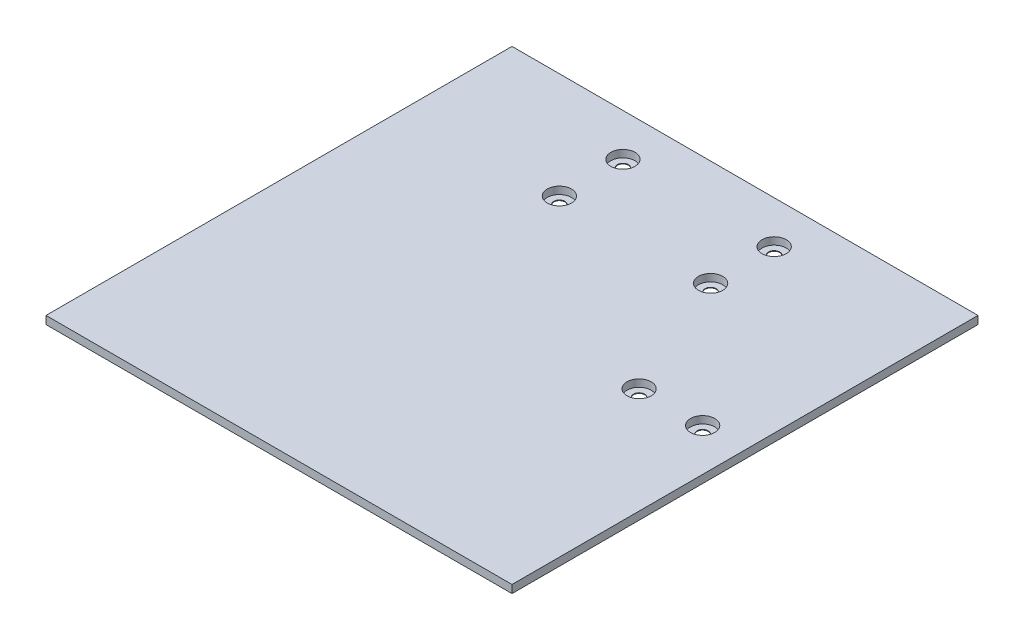
ISO-10303-21;
HEADER;
FILE_DESCRIPTION(('STEP AP214'),'2;1');
FILE_NAME('part.step','',(''),(''),'','','');
FILE_SCHEMA(('AUTOMOTIVE_DESIGN { 1 0 10303 214 1 1 1 1 }'));
ENDSEC;
DATA;
#1=APPLICATION_CONTEXT('core data for automotive mechanical design processes');
#2=APPLICATION_PROTOCOL_DEFINITION('international standard','automotive_design',2000,#1);
#3=PRODUCT_CONTEXT('',#1,'mechanical');
#4=PRODUCT('Part','Part','',(#3));
#5=PRODUCT_RELATED_PRODUCT_CATEGORY('part','',(#4));
#6=PRODUCT_DEFINITION_FORMATION('','',#4);
#7=PRODUCT_DEFINITION_CONTEXT('part definition',#1,'design');
#8=PRODUCT_DEFINITION('design','',#6,#7);
#9=PRODUCT_DEFINITION_SHAPE('','',#8);
#10=(LENGTH_UNIT() NAMED_UNIT(*) SI_UNIT(.MILLI.,.METRE.));
#11=(NAMED_UNIT(*) PLANE_ANGLE_UNIT() SI_UNIT($,.RADIAN.));
#12=(NAMED_UNIT(*) SI_UNIT($,.STERADIAN.) SOLID_ANGLE_UNIT());
#13=UNCERTAINTY_MEASURE_WITH_UNIT(LENGTH_MEASURE(1.E-05),#10,'distance_accuracy_value','');
#14=(GEOMETRIC_REPRESENTATION_CONTEXT(3) GLOBAL_UNCERTAINTY_ASSIGNED_CONTEXT((#13)) GLOBAL_UNIT_ASSIGNED_CONTEXT((#10,
#11,#12)) REPRESENTATION_CONTEXT('',''));
#15=CARTESIAN_POINT('',(0.,0.,0.));
#16=DIRECTION('',(0.,0.,1.));
#17=DIRECTION('',(1.,0.,0.));
#18=AXIS2_PLACEMENT_3D('',#15,#16,#17);
#19=CARTESIAN_POINT('',(-139.7,4.7625,139.7));
#20=DIRECTION('',(-1.,0.,0.));
#21=DIRECTION('',(0.,0.,1.));
#22=AXIS2_PLACEMENT_3D('',#19,#20,#21);
#23=PLANE('',#22);
#24=DIRECTION('',(0.,0.,-1.));
#25=VECTOR('',#24,1.);
#26=CARTESIAN_POINT('',(-139.7,0.,139.7));
#27=LINE('',#26,#25);
#28=CARTESIAN_POINT('',(-139.7,0.,139.7));
#29=VERTEX_POINT('',#28);
#30=CARTESIAN_POINT('',(-139.7,0.,-139.7));
#31=VERTEX_POINT('',#30);
#32=EDGE_CURVE('E117',#29,#31,#27,.T.);
#33=ORIENTED_EDGE('',*,*,#32,.F.);
#34=DIRECTION('',(0.,-1.,0.));
#35=VECTOR('',#34,1.);
#36=CARTESIAN_POINT('',(-139.7,4.7625,139.7));
#37=LINE('',#36,#35);
#38=CARTESIAN_POINT('',(-139.7,4.7625,139.7));
#39=VERTEX_POINT('',#38);
#40=EDGE_CURVE('E11',#39,#29,#37,.T.);
#41=ORIENTED_EDGE('',*,*,#40,.F.);
#42=DIRECTION('',(0.,0.,-1.));
#43=VECTOR('',#42,1.);
#44=CARTESIAN_POINT('',(-139.7,4.7625,139.7));
#45=LINE('',#44,#43);
#46=CARTESIAN_POINT('',(-139.7,4.7625,-139.7));
#47=VERTEX_POINT('',#46);
#48=EDGE_CURVE('E109',#39,#47,#45,.T.);
#49=ORIENTED_EDGE('',*,*,#48,.T.);
#50=DIRECTION('',(0.,-1.,0.));
#51=VECTOR('',#50,1.);
#52=CARTESIAN_POINT('',(-139.7,4.7625,-139.7));
#53=LINE('',#52,#51);
#54=EDGE_CURVE('E48',#47,#31,#53,.T.);
#55=ORIENTED_EDGE('',*,*,#54,.T.);
#56=EDGE_LOOP('',(#33,#41,#49,#55));
#57=FACE_BOUND('',#56,.T.);
#58=ADVANCED_FACE('F45',(#57),#23,.T.);
#59=CARTESIAN_POINT('',(-139.7,4.7625,139.7));
#60=DIRECTION('',(0.,0.,-1.));
#61=DIRECTION('',(-1.,0.,0.));
#62=AXIS2_PLACEMENT_3D('',#59,#60,#61);
#63=PLANE('',#62);
#64=DIRECTION('',(1.,0.,0.));
#65=VECTOR('',#64,1.);
#66=CARTESIAN_POINT('',(-139.7,0.,139.7));
#67=LINE('',#66,#65);
#68=CARTESIAN_POINT('',(139.7,0.,139.7));
#69=VERTEX_POINT('',#68);
#70=EDGE_CURVE('E79',#29,#69,#67,.T.);
#71=ORIENTED_EDGE('',*,*,#70,.T.);
#72=DIRECTION('',(0.,-1.,0.));
#73=VECTOR('',#72,1.);
#74=CARTESIAN_POINT('',(139.7,4.7625,139.7));
#75=LINE('',#74,#73);
#76=CARTESIAN_POINT('',(139.7,4.7625,139.7));
#77=VERTEX_POINT('',#76);
#78=EDGE_CURVE('E55',#77,#69,#75,.T.);
#79=ORIENTED_EDGE('',*,*,#78,.F.);
#80=DIRECTION('',(1.,0.,0.));
#81=VECTOR('',#80,1.);
#82=CARTESIAN_POINT('',(-139.7,4.7625,139.7));
#83=LINE('',#82,#81);
#84=EDGE_CURVE('E96',#39,#77,#83,.T.);
#85=ORIENTED_EDGE('',*,*,#84,.F.);
#86=ORIENTED_EDGE('',*,*,#40,.T.);
#87=EDGE_LOOP('',(#71,#79,#85,#86));
#88=FACE_BOUND('',#87,.T.);
#89=ADVANCED_FACE('F134',(#88),#63,.F.);
#90=CARTESIAN_POINT('',(139.7,4.7625,139.7));
#91=DIRECTION('',(-1.,0.,0.));
#92=DIRECTION('',(0.,0.,1.));
#93=AXIS2_PLACEMENT_3D('',#90,#91,#92);
#94=PLANE('',#93);
#95=DIRECTION('',(0.,0.,-1.));
#96=VECTOR('',#95,1.);
#97=CARTESIAN_POINT('',(139.7,0.,139.7));
#98=LINE('',#97,#96);
#99=CARTESIAN_POINT('',(139.7,0.,-139.7));
#100=VERTEX_POINT('',#99);
#101=EDGE_CURVE('E104',#69,#100,#98,.T.);
#102=ORIENTED_EDGE('',*,*,#101,.T.);
#103=DIRECTION('',(0.,-1.,0.));
#104=VECTOR('',#103,1.);
#105=CARTESIAN_POINT('',(139.7,4.7625,-139.7));
#106=LINE('',#105,#104);
#107=CARTESIAN_POINT('',(139.7,4.7625,-139.7));
#108=VERTEX_POINT('',#107);
#109=EDGE_CURVE('E101',#108,#100,#106,.T.);
#110=ORIENTED_EDGE('',*,*,#109,.F.);
#111=DIRECTION('',(0.,0.,-1.));
#112=VECTOR('',#111,1.);
#113=CARTESIAN_POINT('',(139.7,4.7625,139.7));
#114=LINE('',#113,#112);
#115=EDGE_CURVE('E91',#77,#108,#114,.T.);
#116=ORIENTED_EDGE('',*,*,#115,.F.);
#117=ORIENTED_EDGE('',*,*,#78,.T.);
#118=EDGE_LOOP('',(#102,#110,#116,#117));
#119=FACE_BOUND('',#118,.T.);
#120=ADVANCED_FACE('F102',(#119),#94,.F.);
#121=CARTESIAN_POINT('',(-139.7,4.7625,-139.7));
#122=DIRECTION('',(0.,0.,-1.));
#123=DIRECTION('',(-1.,0.,0.));
#124=AXIS2_PLACEMENT_3D('',#121,#122,#123);
#125=PLANE('',#124);
#126=DIRECTION('',(1.,0.,0.));
#127=VECTOR('',#126,1.);
#128=CARTESIAN_POINT('',(-139.7,0.,-139.7));
#129=LINE('',#128,#127);
#130=EDGE_CURVE('E121',#31,#100,#129,.T.);
#131=ORIENTED_EDGE('',*,*,#130,.F.);
#132=ORIENTED_EDGE('',*,*,#54,.F.);
#133=DIRECTION('',(1.,0.,0.));
#134=VECTOR('',#133,1.);
#135=CARTESIAN_POINT('',(-139.7,4.7625,-139.7));
#136=LINE('',#135,#134);
#137=EDGE_CURVE('E95',#47,#108,#136,.T.);
#138=ORIENTED_EDGE('',*,*,#137,.T.);
#139=ORIENTED_EDGE('',*,*,#109,.T.);
#140=EDGE_LOOP('',(#131,#132,#138,#139));
#141=FACE_BOUND('',#140,.T.);
#142=ADVANCED_FACE('F107',(#141),#125,.T.);
#143=CARTESIAN_POINT('',(0.,4.7625,0.));
#144=DIRECTION('',(0.,-1.,0.));
#145=DIRECTION('',(0.,0.,-1.));
#146=AXIS2_PLACEMENT_3D('',#143,#144,#145);
#147=PLANE('',#146);
#148=CARTESIAN_POINT('',(-47.7927083874704,4.7625,-76.2));
#149=DIRECTION('',(0.,1.,0.));
#150=DIRECTION('',(0.,0.,1.));
#151=AXIS2_PLACEMENT_3D('',#148,#149,#150);
#152=CIRCLE('',#151,7.275);
#153=CARTESIAN_POINT('',(-47.7927083874704,4.7625,-68.925));
#154=VERTEX_POINT('',#153);
#155=EDGE_CURVE('E235',#154,#154,#152,.T.);
#156=ORIENTED_EDGE('',*,*,#155,.F.);
#157=EDGE_LOOP('',(#156));
#158=FACE_BOUND('',#157,.T.);
#159=CARTESIAN_POINT('',(42.8820921140687,4.7625,-76.2));
#160=DIRECTION('',(0.,1.,0.));
#161=DIRECTION('',(0.,0.,1.));
#162=AXIS2_PLACEMENT_3D('',#159,#160,#161);
#163=CIRCLE('',#162,7.275);
#164=CARTESIAN_POINT('',(42.8820921140687,4.7625,-68.925));
#165=VERTEX_POINT('',#164);
#166=EDGE_CURVE('E249',#165,#165,#163,.T.);
#167=ORIENTED_EDGE('',*,*,#166,.F.);
#168=EDGE_LOOP('',(#167));
#169=FACE_BOUND('',#168,.T.);
#170=CARTESIAN_POINT('',(-47.7927083874704,4.7625,-114.3));
#171=DIRECTION('',(0.,1.,0.));
#172=DIRECTION('',(0.,0.,1.));
#173=AXIS2_PLACEMENT_3D('',#170,#171,#172);
#174=CIRCLE('',#173,7.275);
#175=CARTESIAN_POINT('',(-47.7927083874704,4.7625,-107.025));
#176=VERTEX_POINT('',#175);
#177=EDGE_CURVE('E265',#176,#176,#174,.T.);
#178=ORIENTED_EDGE('',*,*,#177,.F.);
#179=EDGE_LOOP('',(#178));
#180=FACE_BOUND('',#179,.T.);
#181=CARTESIAN_POINT('',(42.8820921140687,4.7625,-114.3));
#182=DIRECTION('',(0.,1.,0.));
#183=DIRECTION('',(0.,0.,1.));
#184=AXIS2_PLACEMENT_3D('',#181,#182,#183);
#185=CIRCLE('',#184,7.275);
#186=CARTESIAN_POINT('',(42.8820921140687,4.7625,-107.025));
#187=VERTEX_POINT('',#186);
#188=EDGE_CURVE('E281',#187,#187,#185,.T.);
#189=ORIENTED_EDGE('',*,*,#188,.F.);
#190=EDGE_LOOP('',(#189));
#191=FACE_BOUND('',#190,.T.);
#192=CARTESIAN_POINT('',(76.2,4.7625,0.));
#193=DIRECTION('',(0.,1.,0.));
#194=DIRECTION('',(0.,0.,1.));
#195=AXIS2_PLACEMENT_3D('',#192,#193,#194);
#196=CIRCLE('',#195,7.275);
#197=CARTESIAN_POINT('',(76.2,4.7625,7.27499999999999));
#198=VERTEX_POINT('',#197);
#199=EDGE_CURVE('E297',#198,#198,#196,.T.);
#200=ORIENTED_EDGE('',*,*,#199,.F.);
#201=EDGE_LOOP('',(#200));
#202=FACE_BOUND('',#201,.T.);
#203=CARTESIAN_POINT('',(114.3,4.7625,0.));
#204=DIRECTION('',(0.,1.,0.));
#205=DIRECTION('',(0.,0.,1.));
#206=AXIS2_PLACEMENT_3D('',#203,#204,#205);
#207=CIRCLE('',#206,7.275);
#208=CARTESIAN_POINT('',(114.3,4.7625,7.27499999999999));
#209=VERTEX_POINT('',#208);
#210=EDGE_CURVE('E313',#209,#209,#207,.T.);
#211=ORIENTED_EDGE('',*,*,#210,.F.);
#212=EDGE_LOOP('',(#211));
#213=FACE_BOUND('',#212,.T.);
#214=ORIENTED_EDGE('',*,*,#48,.F.);
#215=ORIENTED_EDGE('',*,*,#84,.T.);
#216=ORIENTED_EDGE('',*,*,#115,.T.);
#217=ORIENTED_EDGE('',*,*,#137,.F.);
#218=EDGE_LOOP('',(#214,#215,#216,#217));
#219=FACE_BOUND('',#218,.T.);
#220=ADVANCED_FACE('F94',(#158,#169,#180,#191,#202,#213,#219),#147,.F.);
#221=CARTESIAN_POINT('',(0.,0.,0.));
#222=DIRECTION('',(0.,-1.,0.));
#223=DIRECTION('',(0.,0.,-1.));
#224=AXIS2_PLACEMENT_3D('',#221,#222,#223);
#225=PLANE('',#224);
#226=CARTESIAN_POINT('',(-47.7927083874704,0.,-76.2));
#227=DIRECTION('',(0.,1.,0.));
#228=DIRECTION('',(0.,0.,1.));
#229=AXIS2_PLACEMENT_3D('',#226,#227,#228);
#230=CIRCLE('',#229,3.3);
#231=CARTESIAN_POINT('',(-47.7927083874704,0.,-72.9));
#232=VERTEX_POINT('',#231);
#233=EDGE_CURVE('E245',#232,#232,#230,.T.);
#234=ORIENTED_EDGE('',*,*,#233,.T.);
#235=EDGE_LOOP('',(#234));
#236=FACE_BOUND('',#235,.T.);
#237=CARTESIAN_POINT('',(42.8820921140687,0.,-76.2));
#238=DIRECTION('',(0.,1.,0.));
#239=DIRECTION('',(0.,0.,1.));
#240=AXIS2_PLACEMENT_3D('',#237,#238,#239);
#241=CIRCLE('',#240,3.3);
#242=CARTESIAN_POINT('',(42.8820921140687,0.,-72.9));
#243=VERTEX_POINT('',#242);
#244=EDGE_CURVE('E261',#243,#243,#241,.T.);
#245=ORIENTED_EDGE('',*,*,#244,.T.);
#246=EDGE_LOOP('',(#245));
#247=FACE_BOUND('',#246,.T.);
#248=CARTESIAN_POINT('',(-47.7927083874704,0.,-114.3));
#249=DIRECTION('',(0.,1.,0.));
#250=DIRECTION('',(0.,0.,1.));
#251=AXIS2_PLACEMENT_3D('',#248,#249,#250);
#252=CIRCLE('',#251,3.3);
#253=CARTESIAN_POINT('',(-47.7927083874704,0.,-111.));
#254=VERTEX_POINT('',#253);
#255=EDGE_CURVE('E277',#254,#254,#252,.T.);
#256=ORIENTED_EDGE('',*,*,#255,.T.);
#257=EDGE_LOOP('',(#256));
#258=FACE_BOUND('',#257,.T.);
#259=CARTESIAN_POINT('',(42.8820921140687,0.,-114.3));
#260=DIRECTION('',(0.,1.,0.));
#261=DIRECTION('',(0.,0.,1.));
#262=AXIS2_PLACEMENT_3D('',#259,#260,#261);
#263=CIRCLE('',#262,3.3);
#264=CARTESIAN_POINT('',(42.8820921140687,0.,-111.));
#265=VERTEX_POINT('',#264);
#266=EDGE_CURVE('E293',#265,#265,#263,.T.);
#267=ORIENTED_EDGE('',*,*,#266,.T.);
#268=EDGE_LOOP('',(#267));
#269=FACE_BOUND('',#268,.T.);
#270=CARTESIAN_POINT('',(76.2,0.,0.));
#271=DIRECTION('',(0.,1.,0.));
#272=DIRECTION('',(0.,0.,1.));
#273=AXIS2_PLACEMENT_3D('',#270,#271,#272);
#274=CIRCLE('',#273,3.3);
#275=CARTESIAN_POINT('',(76.2,0.,3.29999999999998));
#276=VERTEX_POINT('',#275);
#277=EDGE_CURVE('E309',#276,#276,#274,.T.);
#278=ORIENTED_EDGE('',*,*,#277,.T.);
#279=EDGE_LOOP('',(#278));
#280=FACE_BOUND('',#279,.T.);
#281=CARTESIAN_POINT('',(114.3,0.,0.));
#282=DIRECTION('',(0.,1.,0.));
#283=DIRECTION('',(0.,0.,1.));
#284=AXIS2_PLACEMENT_3D('',#281,#282,#283);
#285=CIRCLE('',#284,3.3);
#286=CARTESIAN_POINT('',(114.3,0.,3.29999999999998));
#287=VERTEX_POINT('',#286);
#288=EDGE_CURVE('E122',#287,#287,#285,.T.);
#289=ORIENTED_EDGE('',*,*,#288,.T.);
#290=EDGE_LOOP('',(#289));
#291=FACE_BOUND('',#290,.T.);
#292=ORIENTED_EDGE('',*,*,#32,.T.);
#293=ORIENTED_EDGE('',*,*,#130,.T.);
#294=ORIENTED_EDGE('',*,*,#101,.F.);
#295=ORIENTED_EDGE('',*,*,#70,.F.);
#296=EDGE_LOOP('',(#292,#293,#294,#295));
#297=FACE_BOUND('',#296,.T.);
#298=ADVANCED_FACE('F131',(#236,#247,#258,#269,#280,#291,#297),#225,.T.);
#299=CARTESIAN_POINT('',(114.3,4.7625,0.));
#300=DIRECTION('',(0.,1.,0.));
#301=DIRECTION('',(0.,0.,1.));
#302=AXIS2_PLACEMENT_3D('',#299,#300,#301);
#303=CYLINDRICAL_SURFACE('',#302,3.3);
#304=ORIENTED_EDGE('',*,*,#288,.F.);
#305=EDGE_LOOP('',(#304));
#306=FACE_BOUND('',#305,.T.);
#307=CARTESIAN_POINT('',(114.3,0.3825,0.));
#308=DIRECTION('',(0.,1.,0.));
#309=DIRECTION('',(0.,0.,1.));
#310=AXIS2_PLACEMENT_3D('',#307,#308,#309);
#311=CIRCLE('',#310,3.3);
#312=CARTESIAN_POINT('',(114.3,0.3825,3.29999999999998));
#313=VERTEX_POINT('',#312);
#314=EDGE_CURVE('E321',#313,#313,#311,.T.);
#315=ORIENTED_EDGE('',*,*,#314,.T.);
#316=EDGE_LOOP('',(#315));
#317=FACE_BOUND('',#316,.T.);
#318=ADVANCED_FACE('F153',(#306,#317),#303,.F.);
#319=CARTESIAN_POINT('',(117.6,0.3825,0.));
#320=DIRECTION('',(0.,-1.,0.));
#321=DIRECTION('',(0.,0.,-1.));
#322=AXIS2_PLACEMENT_3D('',#319,#320,#321);
#323=PLANE('',#322);
#324=ORIENTED_EDGE('',*,*,#314,.F.);
#325=EDGE_LOOP('',(#324));
#326=FACE_BOUND('',#325,.T.);
#327=CARTESIAN_POINT('',(114.3,0.3825,0.));
#328=DIRECTION('',(0.,1.,0.));
#329=DIRECTION('',(0.,0.,1.));
#330=AXIS2_PLACEMENT_3D('',#327,#328,#329);
#331=CIRCLE('',#330,7.275);
#332=CARTESIAN_POINT('',(114.3,0.3825,7.27499999999999));
#333=VERTEX_POINT('',#332);
#334=EDGE_CURVE('E317',#333,#333,#331,.T.);
#335=ORIENTED_EDGE('',*,*,#334,.T.);
#336=EDGE_LOOP('',(#335));
#337=FACE_BOUND('',#336,.T.);
#338=ADVANCED_FACE('F160',(#326,#337),#323,.F.);
#339=CARTESIAN_POINT('',(114.3,4.7625,0.));
#340=DIRECTION('',(0.,1.,0.));
#341=DIRECTION('',(0.,0.,1.));
#342=AXIS2_PLACEMENT_3D('',#339,#340,#341);
#343=CYLINDRICAL_SURFACE('',#342,7.275);
#344=ORIENTED_EDGE('',*,*,#334,.F.);
#345=EDGE_LOOP('',(#344));
#346=FACE_BOUND('',#345,.T.);
#347=ORIENTED_EDGE('',*,*,#210,.T.);
#348=EDGE_LOOP('',(#347));
#349=FACE_BOUND('',#348,.T.);
#350=ADVANCED_FACE('F164',(#346,#349),#343,.F.);
#351=CARTESIAN_POINT('',(76.2,4.7625,0.));
#352=DIRECTION('',(0.,1.,0.));
#353=DIRECTION('',(0.,0.,1.));
#354=AXIS2_PLACEMENT_3D('',#351,#352,#353);
#355=CYLINDRICAL_SURFACE('',#354,3.3);
#356=ORIENTED_EDGE('',*,*,#277,.F.);
#357=EDGE_LOOP('',(#356));
#358=FACE_BOUND('',#357,.T.);
#359=CARTESIAN_POINT('',(76.2,0.3825,0.));
#360=DIRECTION('',(0.,1.,0.));
#361=DIRECTION('',(0.,0.,1.));
#362=AXIS2_PLACEMENT_3D('',#359,#360,#361);
#363=CIRCLE('',#362,3.3);
#364=CARTESIAN_POINT('',(76.2,0.3825,3.29999999999998));
#365=VERTEX_POINT('',#364);
#366=EDGE_CURVE('E305',#365,#365,#363,.T.);
#367=ORIENTED_EDGE('',*,*,#366,.T.);
#368=EDGE_LOOP('',(#367));
#369=FACE_BOUND('',#368,.T.);
#370=ADVANCED_FACE('F168',(#358,#369),#355,.F.);
#371=CARTESIAN_POINT('',(79.5,0.3825,0.));
#372=DIRECTION('',(0.,-1.,0.));
#373=DIRECTION('',(0.,0.,-1.));
#374=AXIS2_PLACEMENT_3D('',#371,#372,#373);
#375=PLANE('',#374);
#376=ORIENTED_EDGE('',*,*,#366,.F.);
#377=EDGE_LOOP('',(#376));
#378=FACE_BOUND('',#377,.T.);
#379=CARTESIAN_POINT('',(76.2,0.3825,0.));
#380=DIRECTION('',(0.,1.,0.));
#381=DIRECTION('',(0.,0.,1.));
#382=AXIS2_PLACEMENT_3D('',#379,#380,#381);
#383=CIRCLE('',#382,7.275);
#384=CARTESIAN_POINT('',(76.2,0.3825,7.27499999999999));
#385=VERTEX_POINT('',#384);
#386=EDGE_CURVE('E301',#385,#385,#383,.T.);
#387=ORIENTED_EDGE('',*,*,#386,.T.);
#388=EDGE_LOOP('',(#387));
#389=FACE_BOUND('',#388,.T.);
#390=ADVANCED_FACE('F172',(#378,#389),#375,.F.);
#391=CARTESIAN_POINT('',(76.2,4.7625,0.));
#392=DIRECTION('',(0.,1.,0.));
#393=DIRECTION('',(0.,0.,1.));
#394=AXIS2_PLACEMENT_3D('',#391,#392,#393);
#395=CYLINDRICAL_SURFACE('',#394,7.275);
#396=ORIENTED_EDGE('',*,*,#386,.F.);
#397=EDGE_LOOP('',(#396));
#398=FACE_BOUND('',#397,.T.);
#399=ORIENTED_EDGE('',*,*,#199,.T.);
#400=EDGE_LOOP('',(#399));
#401=FACE_BOUND('',#400,.T.);
#402=ADVANCED_FACE('F176',(#398,#401),#395,.F.);
#403=CARTESIAN_POINT('',(42.8820921140687,4.7625,-114.3));
#404=DIRECTION('',(0.,1.,0.));
#405=DIRECTION('',(0.,0.,1.));
#406=AXIS2_PLACEMENT_3D('',#403,#404,#405);
#407=CYLINDRICAL_SURFACE('',#406,3.3);
#408=ORIENTED_EDGE('',*,*,#266,.F.);
#409=EDGE_LOOP('',(#408));
#410=FACE_BOUND('',#409,.T.);
#411=CARTESIAN_POINT('',(42.8820921140687,0.3825,-114.3));
#412=DIRECTION('',(0.,1.,0.));
#413=DIRECTION('',(0.,0.,1.));
#414=AXIS2_PLACEMENT_3D('',#411,#412,#413);
#415=CIRCLE('',#414,3.3);
#416=CARTESIAN_POINT('',(42.8820921140687,0.3825,-111.));
#417=VERTEX_POINT('',#416);
#418=EDGE_CURVE('E289',#417,#417,#415,.T.);
#419=ORIENTED_EDGE('',*,*,#418,.T.);
#420=EDGE_LOOP('',(#419));
#421=FACE_BOUND('',#420,.T.);
#422=ADVANCED_FACE('F180',(#410,#421),#407,.F.);
#423=CARTESIAN_POINT('',(46.1820921140687,0.3825,-114.3));
#424=DIRECTION('',(0.,-1.,0.));
#425=DIRECTION('',(0.,0.,-1.));
#426=AXIS2_PLACEMENT_3D('',#423,#424,#425);
#427=PLANE('',#426);
#428=ORIENTED_EDGE('',*,*,#418,.F.);
#429=EDGE_LOOP('',(#428));
#430=FACE_BOUND('',#429,.T.);
#431=CARTESIAN_POINT('',(42.8820921140687,0.3825,-114.3));
#432=DIRECTION('',(0.,1.,0.));
#433=DIRECTION('',(0.,0.,1.));
#434=AXIS2_PLACEMENT_3D('',#431,#432,#433);
#435=CIRCLE('',#434,7.275);
#436=CARTESIAN_POINT('',(42.8820921140687,0.3825,-107.025));
#437=VERTEX_POINT('',#436);
#438=EDGE_CURVE('E285',#437,#437,#435,.T.);
#439=ORIENTED_EDGE('',*,*,#438,.T.);
#440=EDGE_LOOP('',(#439));
#441=FACE_BOUND('',#440,.T.);
#442=ADVANCED_FACE('F184',(#430,#441),#427,.F.);
#443=CARTESIAN_POINT('',(42.8820921140687,4.7625,-114.3));
#444=DIRECTION('',(0.,1.,0.));
#445=DIRECTION('',(0.,0.,1.));
#446=AXIS2_PLACEMENT_3D('',#443,#444,#445);
#447=CYLINDRICAL_SURFACE('',#446,7.275);
#448=ORIENTED_EDGE('',*,*,#438,.F.);
#449=EDGE_LOOP('',(#448));
#450=FACE_BOUND('',#449,.T.);
#451=ORIENTED_EDGE('',*,*,#188,.T.);
#452=EDGE_LOOP('',(#451));
#453=FACE_BOUND('',#452,.T.);
#454=ADVANCED_FACE('F188',(#450,#453),#447,.F.);
#455=CARTESIAN_POINT('',(-47.7927083874704,4.7625,-114.3));
#456=DIRECTION('',(0.,1.,0.));
#457=DIRECTION('',(0.,0.,1.));
#458=AXIS2_PLACEMENT_3D('',#455,#456,#457);
#459=CYLINDRICAL_SURFACE('',#458,3.3);
#460=ORIENTED_EDGE('',*,*,#255,.F.);
#461=EDGE_LOOP('',(#460));
#462=FACE_BOUND('',#461,.T.);
#463=CARTESIAN_POINT('',(-47.7927083874704,0.3825,-114.3));
#464=DIRECTION('',(0.,1.,0.));
#465=DIRECTION('',(0.,0.,1.));
#466=AXIS2_PLACEMENT_3D('',#463,#464,#465);
#467=CIRCLE('',#466,3.3);
#468=CARTESIAN_POINT('',(-47.7927083874704,0.3825,-111.));
#469=VERTEX_POINT('',#468);
#470=EDGE_CURVE('E273',#469,#469,#467,.T.);
#471=ORIENTED_EDGE('',*,*,#470,.T.);
#472=EDGE_LOOP('',(#471));
#473=FACE_BOUND('',#472,.T.);
#474=ADVANCED_FACE('F192',(#462,#473),#459,.F.);
#475=CARTESIAN_POINT('',(-44.4927083874704,0.3825,-114.3));
#476=DIRECTION('',(0.,-1.,0.));
#477=DIRECTION('',(0.,0.,-1.));
#478=AXIS2_PLACEMENT_3D('',#475,#476,#477);
#479=PLANE('',#478);
#480=ORIENTED_EDGE('',*,*,#470,.F.);
#481=EDGE_LOOP('',(#480));
#482=FACE_BOUND('',#481,.T.);
#483=CARTESIAN_POINT('',(-47.7927083874704,0.3825,-114.3));
#484=DIRECTION('',(0.,1.,0.));
#485=DIRECTION('',(0.,0.,1.));
#486=AXIS2_PLACEMENT_3D('',#483,#484,#485);
#487=CIRCLE('',#486,7.275);
#488=CARTESIAN_POINT('',(-47.7927083874704,0.3825,-107.025));
#489=VERTEX_POINT('',#488);
#490=EDGE_CURVE('E269',#489,#489,#487,.T.);
#491=ORIENTED_EDGE('',*,*,#490,.T.);
#492=EDGE_LOOP('',(#491));
#493=FACE_BOUND('',#492,.T.);
#494=ADVANCED_FACE('F196',(#482,#493),#479,.F.);
#495=CARTESIAN_POINT('',(-47.7927083874704,4.7625,-114.3));
#496=DIRECTION('',(0.,1.,0.));
#497=DIRECTION('',(0.,0.,1.));
#498=AXIS2_PLACEMENT_3D('',#495,#496,#497);
#499=CYLINDRICAL_SURFACE('',#498,7.275);
#500=ORIENTED_EDGE('',*,*,#490,.F.);
#501=EDGE_LOOP('',(#500));
#502=FACE_BOUND('',#501,.T.);
#503=ORIENTED_EDGE('',*,*,#177,.T.);
#504=EDGE_LOOP('',(#503));
#505=FACE_BOUND('',#504,.T.);
#506=ADVANCED_FACE('F200',(#502,#505),#499,.F.);
#507=CARTESIAN_POINT('',(42.8820921140687,4.7625,-76.2));
#508=DIRECTION('',(0.,1.,0.));
#509=DIRECTION('',(0.,0.,1.));
#510=AXIS2_PLACEMENT_3D('',#507,#508,#509);
#511=CYLINDRICAL_SURFACE('',#510,3.3);
#512=ORIENTED_EDGE('',*,*,#244,.F.);
#513=EDGE_LOOP('',(#512));
#514=FACE_BOUND('',#513,.T.);
#515=CARTESIAN_POINT('',(42.8820921140687,0.3825,-76.2));
#516=DIRECTION('',(0.,1.,0.));
#517=DIRECTION('',(0.,0.,1.));
#518=AXIS2_PLACEMENT_3D('',#515,#516,#517);
#519=CIRCLE('',#518,3.3);
#520=CARTESIAN_POINT('',(42.8820921140687,0.3825,-72.9));
#521=VERTEX_POINT('',#520);
#522=EDGE_CURVE('E257',#521,#521,#519,.T.);
#523=ORIENTED_EDGE('',*,*,#522,.T.);
#524=EDGE_LOOP('',(#523));
#525=FACE_BOUND('',#524,.T.);
#526=ADVANCED_FACE('F204',(#514,#525),#511,.F.);
#527=CARTESIAN_POINT('',(46.1820921140687,0.3825,-76.2));
#528=DIRECTION('',(0.,-1.,0.));
#529=DIRECTION('',(0.,0.,-1.));
#530=AXIS2_PLACEMENT_3D('',#527,#528,#529);
#531=PLANE('',#530);
#532=ORIENTED_EDGE('',*,*,#522,.F.);
#533=EDGE_LOOP('',(#532));
#534=FACE_BOUND('',#533,.T.);
#535=CARTESIAN_POINT('',(42.8820921140687,0.3825,-76.2));
#536=DIRECTION('',(0.,1.,0.));
#537=DIRECTION('',(0.,0.,1.));
#538=AXIS2_PLACEMENT_3D('',#535,#536,#537);
#539=CIRCLE('',#538,7.275);
#540=CARTESIAN_POINT('',(42.8820921140687,0.3825,-68.925));
#541=VERTEX_POINT('',#540);
#542=EDGE_CURVE('E253',#541,#541,#539,.T.);
#543=ORIENTED_EDGE('',*,*,#542,.T.);
#544=EDGE_LOOP('',(#543));
#545=FACE_BOUND('',#544,.T.);
#546=ADVANCED_FACE('F208',(#534,#545),#531,.F.);
#547=CARTESIAN_POINT('',(42.8820921140687,4.7625,-76.2));
#548=DIRECTION('',(0.,1.,0.));
#549=DIRECTION('',(0.,0.,1.));
#550=AXIS2_PLACEMENT_3D('',#547,#548,#549);
#551=CYLINDRICAL_SURFACE('',#550,7.275);
#552=ORIENTED_EDGE('',*,*,#542,.F.);
#553=EDGE_LOOP('',(#552));
#554=FACE_BOUND('',#553,.T.);
#555=ORIENTED_EDGE('',*,*,#166,.T.);
#556=EDGE_LOOP('',(#555));
#557=FACE_BOUND('',#556,.T.);
#558=ADVANCED_FACE('F212',(#554,#557),#551,.F.);
#559=CARTESIAN_POINT('',(-47.7927083874704,4.7625,-76.2));
#560=DIRECTION('',(0.,1.,0.));
#561=DIRECTION('',(0.,0.,1.));
#562=AXIS2_PLACEMENT_3D('',#559,#560,#561);
#563=CYLINDRICAL_SURFACE('',#562,3.3);
#564=ORIENTED_EDGE('',*,*,#233,.F.);
#565=EDGE_LOOP('',(#564));
#566=FACE_BOUND('',#565,.T.);
#567=CARTESIAN_POINT('',(-47.7927083874704,0.3825,-76.2));
#568=DIRECTION('',(0.,1.,0.));
#569=DIRECTION('',(0.,0.,1.));
#570=AXIS2_PLACEMENT_3D('',#567,#568,#569);
#571=CIRCLE('',#570,3.3);
#572=CARTESIAN_POINT('',(-47.7927083874704,0.3825,-72.9));
#573=VERTEX_POINT('',#572);
#574=EDGE_CURVE('E239',#573,#573,#571,.T.);
#575=ORIENTED_EDGE('',*,*,#574,.T.);
#576=EDGE_LOOP('',(#575));
#577=FACE_BOUND('',#576,.T.);
#578=ADVANCED_FACE('F216',(#566,#577),#563,.F.);
#579=CARTESIAN_POINT('',(-44.4927083874704,0.3825,-76.2));
#580=DIRECTION('',(0.,-1.,0.));
#581=DIRECTION('',(0.,0.,-1.));
#582=AXIS2_PLACEMENT_3D('',#579,#580,#581);
#583=PLANE('',#582);
#584=ORIENTED_EDGE('',*,*,#574,.F.);
#585=EDGE_LOOP('',(#584));
#586=FACE_BOUND('',#585,.T.);
#587=CARTESIAN_POINT('',(-47.7927083874704,0.3825,-76.2));
#588=DIRECTION('',(0.,1.,0.));
#589=DIRECTION('',(0.,0.,1.));
#590=AXIS2_PLACEMENT_3D('',#587,#588,#589);
#591=CIRCLE('',#590,7.275);
#592=CARTESIAN_POINT('',(-47.7927083874704,0.3825,-68.925));
#593=VERTEX_POINT('',#592);
#594=EDGE_CURVE('E233',#593,#593,#591,.T.);
#595=ORIENTED_EDGE('',*,*,#594,.T.);
#596=EDGE_LOOP('',(#595));
#597=FACE_BOUND('',#596,.T.);
#598=ADVANCED_FACE('F220',(#586,#597),#583,.F.);
#599=CARTESIAN_POINT('',(-47.7927083874704,4.7625,-76.2));
#600=DIRECTION('',(0.,1.,0.));
#601=DIRECTION('',(0.,0.,1.));
#602=AXIS2_PLACEMENT_3D('',#599,#600,#601);
#603=CYLINDRICAL_SURFACE('',#602,7.275);
#604=ORIENTED_EDGE('',*,*,#594,.F.);
#605=EDGE_LOOP('',(#604));
#606=FACE_BOUND('',#605,.T.);
#607=ORIENTED_EDGE('',*,*,#155,.T.);
#608=EDGE_LOOP('',(#607));
#609=FACE_BOUND('',#608,.T.);
#610=ADVANCED_FACE('F224',(#606,#609),#603,.F.);
#611=CLOSED_SHELL('',(#58,#89,#120,#142,#220,#298,#318,#338,#350,#370,#390,#402,#422,#442,#454,
#474,#494,#506,#526,#546,#558,#578,#598,#610));
#612=MANIFOLD_SOLID_BREP('B2',#611);
#613=ADVANCED_BREP_SHAPE_REPRESENTATION('',(#18,#612),#14);
#614=SHAPE_DEFINITION_REPRESENTATION(#9,#613);
ENDSEC;
END-ISO-10303-21;
